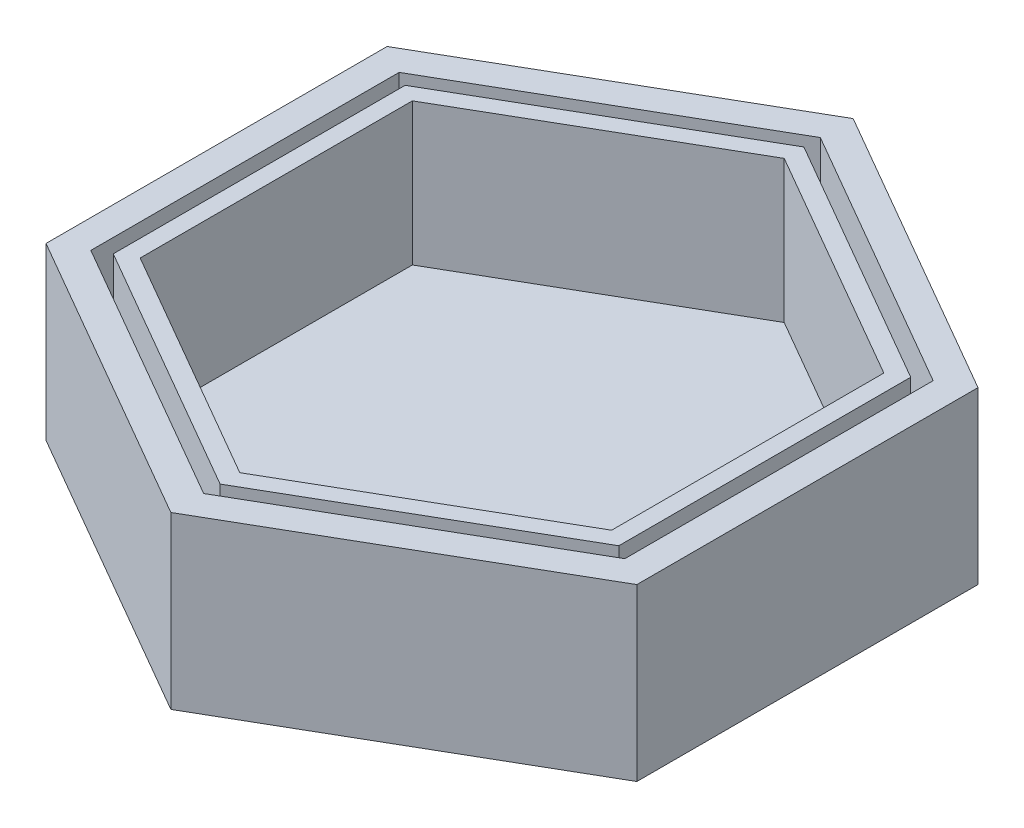
ISO-10303-21;
HEADER;
FILE_DESCRIPTION(('STEP AP214'),'2;1');
FILE_NAME('part.step','',(''),(''),'','','');
FILE_SCHEMA(('AUTOMOTIVE_DESIGN { 1 0 10303 214 1 1 1 1 }'));
ENDSEC;
DATA;
#1=APPLICATION_CONTEXT('core data for automotive mechanical design processes');
#2=APPLICATION_PROTOCOL_DEFINITION('international standard','automotive_design',2000,#1);
#3=PRODUCT_CONTEXT('',#1,'mechanical');
#4=PRODUCT('Part','Part','',(#3));
#5=PRODUCT_RELATED_PRODUCT_CATEGORY('part','',(#4));
#6=PRODUCT_DEFINITION_FORMATION('','',#4);
#7=PRODUCT_DEFINITION_CONTEXT('part definition',#1,'design');
#8=PRODUCT_DEFINITION('design','',#6,#7);
#9=PRODUCT_DEFINITION_SHAPE('','',#8);
#10=(LENGTH_UNIT() NAMED_UNIT(*) SI_UNIT(.MILLI.,.METRE.));
#11=(NAMED_UNIT(*) PLANE_ANGLE_UNIT() SI_UNIT($,.RADIAN.));
#12=(NAMED_UNIT(*) SI_UNIT($,.STERADIAN.) SOLID_ANGLE_UNIT());
#13=UNCERTAINTY_MEASURE_WITH_UNIT(LENGTH_MEASURE(1.E-05),#10,'distance_accuracy_value','');
#14=(GEOMETRIC_REPRESENTATION_CONTEXT(3) GLOBAL_UNCERTAINTY_ASSIGNED_CONTEXT((#13)) GLOBAL_UNIT_ASSIGNED_CONTEXT((#10,
#11,#12)) REPRESENTATION_CONTEXT('',''));
#15=CARTESIAN_POINT('',(0.,0.,0.));
#16=DIRECTION('',(0.,0.,1.));
#17=DIRECTION('',(1.,0.,0.));
#18=AXIS2_PLACEMENT_3D('',#15,#16,#17);
#19=CARTESIAN_POINT('',(-51.9615242270663,5.,30.));
#20=DIRECTION('',(0.5,0.,-0.866025403784439));
#21=DIRECTION('',(-0.866025403784439,0.,-0.5));
#22=AXIS2_PLACEMENT_3D('',#19,#20,#21);
#23=PLANE('',#22);
#24=DIRECTION('',(0.866025403784439,0.,0.5));
#25=VECTOR('',#24,1.);
#26=CARTESIAN_POINT('',(-51.9615242270663,0.,30.));
#27=LINE('',#26,#25);
#28=CARTESIAN_POINT('',(-51.9615242270663,0.,30.));
#29=VERTEX_POINT('',#28);
#30=CARTESIAN_POINT('',(0.,0.,60.));
#31=VERTEX_POINT('',#30);
#32=EDGE_CURVE('E392',#29,#31,#27,.T.);
#33=ORIENTED_EDGE('',*,*,#32,.T.);
#34=DIRECTION('',(0.,-1.,0.));
#35=VECTOR('',#34,1.);
#36=CARTESIAN_POINT('',(0.,5.,60.));
#37=LINE('',#36,#35);
#38=CARTESIAN_POINT('',(0.,30.,60.));
#39=VERTEX_POINT('',#38);
#40=EDGE_CURVE('E11',#39,#31,#37,.T.);
#41=ORIENTED_EDGE('',*,*,#40,.F.);
#42=DIRECTION('',(0.866025403784439,0.,0.5));
#43=VECTOR('',#42,1.);
#44=CARTESIAN_POINT('',(-51.9615242270663,30.,30.));
#45=LINE('',#44,#43);
#46=CARTESIAN_POINT('',(-51.9615242270663,30.,30.));
#47=VERTEX_POINT('',#46);
#48=EDGE_CURVE('E377',#47,#39,#45,.T.);
#49=ORIENTED_EDGE('',*,*,#48,.F.);
#50=DIRECTION('',(0.,-1.,0.));
#51=VECTOR('',#50,1.);
#52=CARTESIAN_POINT('',(-51.9615242270663,5.,30.));
#53=LINE('',#52,#51);
#54=EDGE_CURVE('E405',#47,#29,#53,.T.);
#55=ORIENTED_EDGE('',*,*,#54,.T.);
#56=EDGE_LOOP('',(#33,#41,#49,#55));
#57=FACE_BOUND('',#56,.T.);
#58=ADVANCED_FACE('F43',(#57),#23,.F.);
#59=CARTESIAN_POINT('',(0.,5.,60.));
#60=DIRECTION('',(-0.5,0.,-0.866025403784439));
#61=DIRECTION('',(-0.866025403784439,0.,0.5));
#62=AXIS2_PLACEMENT_3D('',#59,#60,#61);
#63=PLANE('',#62);
#64=DIRECTION('',(0.866025403784439,0.,-0.5));
#65=VECTOR('',#64,1.);
#66=CARTESIAN_POINT('',(0.,0.,60.));
#67=LINE('',#66,#65);
#68=CARTESIAN_POINT('',(51.9615242270663,0.,30.));
#69=VERTEX_POINT('',#68);
#70=EDGE_CURVE('E395',#31,#69,#67,.T.);
#71=ORIENTED_EDGE('',*,*,#70,.T.);
#72=DIRECTION('',(0.,-1.,0.));
#73=VECTOR('',#72,1.);
#74=CARTESIAN_POINT('',(51.9615242270663,5.,30.));
#75=LINE('',#74,#73);
#76=CARTESIAN_POINT('',(51.9615242270663,30.,30.));
#77=VERTEX_POINT('',#76);
#78=EDGE_CURVE('E50',#77,#69,#75,.T.);
#79=ORIENTED_EDGE('',*,*,#78,.F.);
#80=DIRECTION('',(0.866025403784439,0.,-0.5));
#81=VECTOR('',#80,1.);
#82=CARTESIAN_POINT('',(0.,30.,60.));
#83=LINE('',#82,#81);
#84=EDGE_CURVE('E380',#39,#77,#83,.T.);
#85=ORIENTED_EDGE('',*,*,#84,.F.);
#86=ORIENTED_EDGE('',*,*,#40,.T.);
#87=EDGE_LOOP('',(#71,#79,#85,#86));
#88=FACE_BOUND('',#87,.T.);
#89=ADVANCED_FACE('F443',(#88),#63,.F.);
#90=CARTESIAN_POINT('',(51.9615242270663,5.,30.));
#91=DIRECTION('',(-1.,0.,0.));
#92=DIRECTION('',(0.,0.,1.));
#93=AXIS2_PLACEMENT_3D('',#90,#91,#92);
#94=PLANE('',#93);
#95=DIRECTION('',(0.,0.,-1.));
#96=VECTOR('',#95,1.);
#97=CARTESIAN_POINT('',(51.9615242270663,0.,30.));
#98=LINE('',#97,#96);
#99=CARTESIAN_POINT('',(51.9615242270663,0.,-30.));
#100=VERTEX_POINT('',#99);
#101=EDGE_CURVE('E397',#69,#100,#98,.T.);
#102=ORIENTED_EDGE('',*,*,#101,.T.);
#103=DIRECTION('',(0.,-1.,0.));
#104=VECTOR('',#103,1.);
#105=CARTESIAN_POINT('',(51.9615242270663,5.,-30.));
#106=LINE('',#105,#104);
#107=CARTESIAN_POINT('',(51.9615242270663,30.,-30.));
#108=VERTEX_POINT('',#107);
#109=EDGE_CURVE('E414',#108,#100,#106,.T.);
#110=ORIENTED_EDGE('',*,*,#109,.F.);
#111=DIRECTION('',(0.,0.,-1.));
#112=VECTOR('',#111,1.);
#113=CARTESIAN_POINT('',(51.9615242270663,30.,30.));
#114=LINE('',#113,#112);
#115=EDGE_CURVE('E383',#77,#108,#114,.T.);
#116=ORIENTED_EDGE('',*,*,#115,.F.);
#117=ORIENTED_EDGE('',*,*,#78,.T.);
#118=EDGE_LOOP('',(#102,#110,#116,#117));
#119=FACE_BOUND('',#118,.T.);
#120=ADVANCED_FACE('F420',(#119),#94,.F.);
#121=CARTESIAN_POINT('',(51.9615242270663,5.,-30.));
#122=DIRECTION('',(-0.5,0.,0.866025403784439));
#123=DIRECTION('',(0.866025403784439,0.,0.5));
#124=AXIS2_PLACEMENT_3D('',#121,#122,#123);
#125=PLANE('',#124);
#126=DIRECTION('',(-0.866025403784439,0.,-0.5));
#127=VECTOR('',#126,1.);
#128=CARTESIAN_POINT('',(51.9615242270663,0.,-30.));
#129=LINE('',#128,#127);
#130=CARTESIAN_POINT('',(0.,0.,-60.));
#131=VERTEX_POINT('',#130);
#132=EDGE_CURVE('E399',#100,#131,#129,.T.);
#133=ORIENTED_EDGE('',*,*,#132,.T.);
#134=DIRECTION('',(0.,-1.,0.));
#135=VECTOR('',#134,1.);
#136=CARTESIAN_POINT('',(0.,5.,-60.));
#137=LINE('',#136,#135);
#138=CARTESIAN_POINT('',(0.,30.,-60.));
#139=VERTEX_POINT('',#138);
#140=EDGE_CURVE('E411',#139,#131,#137,.T.);
#141=ORIENTED_EDGE('',*,*,#140,.F.);
#142=DIRECTION('',(-0.866025403784439,0.,-0.5));
#143=VECTOR('',#142,1.);
#144=CARTESIAN_POINT('',(51.9615242270663,30.,-30.));
#145=LINE('',#144,#143);
#146=EDGE_CURVE('E386',#108,#139,#145,.T.);
#147=ORIENTED_EDGE('',*,*,#146,.F.);
#148=ORIENTED_EDGE('',*,*,#109,.T.);
#149=EDGE_LOOP('',(#133,#141,#147,#148));
#150=FACE_BOUND('',#149,.T.);
#151=ADVANCED_FACE('F430',(#150),#125,.F.);
#152=CARTESIAN_POINT('',(0.,5.,-60.));
#153=DIRECTION('',(0.5,0.,0.866025403784439));
#154=DIRECTION('',(0.866025403784439,0.,-0.5));
#155=AXIS2_PLACEMENT_3D('',#152,#153,#154);
#156=PLANE('',#155);
#157=DIRECTION('',(-0.866025403784439,0.,0.5));
#158=VECTOR('',#157,1.);
#159=CARTESIAN_POINT('',(0.,0.,-60.));
#160=LINE('',#159,#158);
#161=CARTESIAN_POINT('',(-51.9615242270663,0.,-30.));
#162=VERTEX_POINT('',#161);
#163=EDGE_CURVE('E401',#131,#162,#160,.T.);
#164=ORIENTED_EDGE('',*,*,#163,.T.);
#165=DIRECTION('',(0.,-1.,0.));
#166=VECTOR('',#165,1.);
#167=CARTESIAN_POINT('',(-51.9615242270663,5.,-30.));
#168=LINE('',#167,#166);
#169=CARTESIAN_POINT('',(-51.9615242270663,30.,-30.));
#170=VERTEX_POINT('',#169);
#171=EDGE_CURVE('E408',#170,#162,#168,.T.);
#172=ORIENTED_EDGE('',*,*,#171,.F.);
#173=DIRECTION('',(-0.866025403784439,0.,0.5));
#174=VECTOR('',#173,1.);
#175=CARTESIAN_POINT('',(0.,30.,-60.));
#176=LINE('',#175,#174);
#177=EDGE_CURVE('E389',#139,#170,#176,.T.);
#178=ORIENTED_EDGE('',*,*,#177,.F.);
#179=ORIENTED_EDGE('',*,*,#140,.T.);
#180=EDGE_LOOP('',(#164,#172,#178,#179));
#181=FACE_BOUND('',#180,.T.);
#182=ADVANCED_FACE('F434',(#181),#156,.F.);
#183=CARTESIAN_POINT('',(-51.9615242270663,5.,-30.));
#184=DIRECTION('',(1.,0.,0.));
#185=DIRECTION('',(0.,0.,-1.));
#186=AXIS2_PLACEMENT_3D('',#183,#184,#185);
#187=PLANE('',#186);
#188=DIRECTION('',(0.,0.,1.));
#189=VECTOR('',#188,1.);
#190=CARTESIAN_POINT('',(-51.9615242270663,0.,-30.));
#191=LINE('',#190,#189);
#192=EDGE_CURVE('E403',#162,#29,#191,.T.);
#193=ORIENTED_EDGE('',*,*,#192,.T.);
#194=ORIENTED_EDGE('',*,*,#54,.F.);
#195=DIRECTION('',(0.,0.,1.));
#196=VECTOR('',#195,1.);
#197=CARTESIAN_POINT('',(-51.9615242270663,30.,-30.));
#198=LINE('',#197,#196);
#199=EDGE_CURVE('E374',#170,#47,#198,.T.);
#200=ORIENTED_EDGE('',*,*,#199,.F.);
#201=ORIENTED_EDGE('',*,*,#171,.T.);
#202=EDGE_LOOP('',(#193,#194,#200,#201));
#203=FACE_BOUND('',#202,.T.);
#204=ADVANCED_FACE('F440',(#203),#187,.F.);
#205=CARTESIAN_POINT('',(0.,0.,0.));
#206=DIRECTION('',(0.,1.,0.));
#207=DIRECTION('',(0.,0.,1.));
#208=AXIS2_PLACEMENT_3D('',#205,#206,#207);
#209=PLANE('',#208);
#210=ORIENTED_EDGE('',*,*,#32,.F.);
#211=ORIENTED_EDGE('',*,*,#192,.F.);
#212=ORIENTED_EDGE('',*,*,#163,.F.);
#213=ORIENTED_EDGE('',*,*,#132,.F.);
#214=ORIENTED_EDGE('',*,*,#101,.F.);
#215=ORIENTED_EDGE('',*,*,#70,.F.);
#216=EDGE_LOOP('',(#210,#211,#212,#213,#214,#215));
#217=FACE_BOUND('',#216,.T.);
#218=ADVANCED_FACE('F426',(#217),#209,.F.);
#219=CARTESIAN_POINT('',(0.,30.,0.));
#220=DIRECTION('',(0.,1.,0.));
#221=DIRECTION('',(0.,0.,1.));
#222=AXIS2_PLACEMENT_3D('',#219,#220,#221);
#223=PLANE('',#222);
#224=ORIENTED_EDGE('',*,*,#199,.T.);
#225=ORIENTED_EDGE('',*,*,#48,.T.);
#226=ORIENTED_EDGE('',*,*,#84,.T.);
#227=ORIENTED_EDGE('',*,*,#115,.T.);
#228=ORIENTED_EDGE('',*,*,#146,.T.);
#229=ORIENTED_EDGE('',*,*,#177,.T.);
#230=EDGE_LOOP('',(#224,#225,#226,#227,#228,#229));
#231=FACE_BOUND('',#230,.T.);
#232=DIRECTION('',(0.866025403784439,0.,0.5));
#233=VECTOR('',#232,1.);
#234=CARTESIAN_POINT('',(-46.9615242270663,30.,27.1132486540519));
#235=LINE('',#234,#233);
#236=CARTESIAN_POINT('',(-46.9615242270663,30.,27.1132486540519));
#237=VERTEX_POINT('',#236);
#238=CARTESIAN_POINT('',(0.,30.,54.2264973081037));
#239=VERTEX_POINT('',#238);
#240=EDGE_CURVE('E334',#237,#239,#235,.T.);
#241=ORIENTED_EDGE('',*,*,#240,.F.);
#242=DIRECTION('',(0.,0.,1.));
#243=VECTOR('',#242,1.);
#244=CARTESIAN_POINT('',(-46.9615242270663,30.,-27.1132486540519));
#245=LINE('',#244,#243);
#246=CARTESIAN_POINT('',(-46.9615242270663,30.,-27.1132486540519));
#247=VERTEX_POINT('',#246);
#248=EDGE_CURVE('E332',#247,#237,#245,.T.);
#249=ORIENTED_EDGE('',*,*,#248,.F.);
#250=DIRECTION('',(-0.866025403784439,0.,0.5));
#251=VECTOR('',#250,1.);
#252=CARTESIAN_POINT('',(0.,30.,-54.2264973081037));
#253=LINE('',#252,#251);
#254=CARTESIAN_POINT('',(0.,30.,-54.2264973081037));
#255=VERTEX_POINT('',#254);
#256=EDGE_CURVE('E344',#255,#247,#253,.T.);
#257=ORIENTED_EDGE('',*,*,#256,.F.);
#258=DIRECTION('',(-0.866025403784439,0.,-0.5));
#259=VECTOR('',#258,1.);
#260=CARTESIAN_POINT('',(46.9615242270663,30.,-27.1132486540519));
#261=LINE('',#260,#259);
#262=CARTESIAN_POINT('',(46.9615242270663,30.,-27.1132486540519));
#263=VERTEX_POINT('',#262);
#264=EDGE_CURVE('E341',#263,#255,#261,.T.);
#265=ORIENTED_EDGE('',*,*,#264,.F.);
#266=DIRECTION('',(0.,0.,-1.));
#267=VECTOR('',#266,1.);
#268=CARTESIAN_POINT('',(46.9615242270663,30.,27.1132486540519));
#269=LINE('',#268,#267);
#270=CARTESIAN_POINT('',(46.9615242270663,30.,27.1132486540519));
#271=VERTEX_POINT('',#270);
#272=EDGE_CURVE('E339',#271,#263,#269,.T.);
#273=ORIENTED_EDGE('',*,*,#272,.F.);
#274=DIRECTION('',(0.866025403784439,0.,-0.5));
#275=VECTOR('',#274,1.);
#276=CARTESIAN_POINT('',(0.,30.,54.2264973081037));
#277=LINE('',#276,#275);
#278=EDGE_CURVE('E337',#239,#271,#277,.T.);
#279=ORIENTED_EDGE('',*,*,#278,.F.);
#280=EDGE_LOOP('',(#241,#249,#257,#265,#273,#279));
#281=FACE_BOUND('',#280,.T.);
#282=ADVANCED_FACE('F437',(#231,#281),#223,.T.);
#283=CARTESIAN_POINT('',(-46.9615242270663,30.,-27.1132486540519));
#284=DIRECTION('',(1.,0.,0.));
#285=DIRECTION('',(0.,0.,-1.));
#286=AXIS2_PLACEMENT_3D('',#283,#284,#285);
#287=PLANE('',#286);
#288=DIRECTION('',(0.,0.,1.));
#289=VECTOR('',#288,1.);
#290=CARTESIAN_POINT('',(-46.9615242270663,5.,-27.1132486540519));
#291=LINE('',#290,#289);
#292=CARTESIAN_POINT('',(-46.9615242270663,5.,-27.1132486540519));
#293=VERTEX_POINT('',#292);
#294=CARTESIAN_POINT('',(-46.9615242270663,5.,27.1132486540519));
#295=VERTEX_POINT('',#294);
#296=EDGE_CURVE('E331',#293,#295,#291,.T.);
#297=ORIENTED_EDGE('',*,*,#296,.F.);
#298=DIRECTION('',(0.,-1.,0.));
#299=VECTOR('',#298,1.);
#300=CARTESIAN_POINT('',(-46.9615242270663,30.,-27.1132486540519));
#301=LINE('',#300,#299);
#302=EDGE_CURVE('E346',#247,#293,#301,.T.);
#303=ORIENTED_EDGE('',*,*,#302,.F.);
#304=ORIENTED_EDGE('',*,*,#248,.T.);
#305=DIRECTION('',(0.,-1.,0.));
#306=VECTOR('',#305,1.);
#307=CARTESIAN_POINT('',(-46.9615242270663,30.,27.1132486540519));
#308=LINE('',#307,#306);
#309=EDGE_CURVE('E371',#237,#295,#308,.T.);
#310=ORIENTED_EDGE('',*,*,#309,.T.);
#311=EDGE_LOOP('',(#297,#303,#304,#310));
#312=FACE_BOUND('',#311,.T.);
#313=ADVANCED_FACE('F465',(#312),#287,.T.);
#314=CARTESIAN_POINT('',(-46.9615242270663,30.,27.1132486540519));
#315=DIRECTION('',(0.5,0.,-0.866025403784439));
#316=DIRECTION('',(-0.866025403784439,0.,-0.5));
#317=AXIS2_PLACEMENT_3D('',#314,#315,#316);
#318=PLANE('',#317);
#319=DIRECTION('',(0.866025403784439,0.,0.5));
#320=VECTOR('',#319,1.);
#321=CARTESIAN_POINT('',(-46.9615242270663,5.,27.1132486540519));
#322=LINE('',#321,#320);
#323=CARTESIAN_POINT('',(0.,5.,54.2264973081037));
#324=VERTEX_POINT('',#323);
#325=EDGE_CURVE('E348',#295,#324,#322,.T.);
#326=ORIENTED_EDGE('',*,*,#325,.F.);
#327=ORIENTED_EDGE('',*,*,#309,.F.);
#328=ORIENTED_EDGE('',*,*,#240,.T.);
#329=DIRECTION('',(0.,-1.,0.));
#330=VECTOR('',#329,1.);
#331=CARTESIAN_POINT('',(0.,30.,54.2264973081037));
#332=LINE('',#331,#330);
#333=EDGE_CURVE('E368',#239,#324,#332,.T.);
#334=ORIENTED_EDGE('',*,*,#333,.T.);
#335=EDGE_LOOP('',(#326,#327,#328,#334));
#336=FACE_BOUND('',#335,.T.);
#337=ADVANCED_FACE('F468',(#336),#318,.T.);
#338=CARTESIAN_POINT('',(0.,30.,54.2264973081037));
#339=DIRECTION('',(-0.5,0.,-0.866025403784439));
#340=DIRECTION('',(-0.866025403784439,0.,0.5));
#341=AXIS2_PLACEMENT_3D('',#338,#339,#340);
#342=PLANE('',#341);
#343=DIRECTION('',(0.866025403784439,0.,-0.5));
#344=VECTOR('',#343,1.);
#345=CARTESIAN_POINT('',(0.,5.,54.2264973081037));
#346=LINE('',#345,#344);
#347=CARTESIAN_POINT('',(46.9615242270663,5.,27.1132486540519));
#348=VERTEX_POINT('',#347);
#349=EDGE_CURVE('E350',#324,#348,#346,.T.);
#350=ORIENTED_EDGE('',*,*,#349,.F.);
#351=ORIENTED_EDGE('',*,*,#333,.F.);
#352=ORIENTED_EDGE('',*,*,#278,.T.);
#353=DIRECTION('',(0.,-1.,0.));
#354=VECTOR('',#353,1.);
#355=CARTESIAN_POINT('',(46.9615242270663,30.,27.1132486540519));
#356=LINE('',#355,#354);
#357=EDGE_CURVE('E365',#271,#348,#356,.T.);
#358=ORIENTED_EDGE('',*,*,#357,.T.);
#359=EDGE_LOOP('',(#350,#351,#352,#358));
#360=FACE_BOUND('',#359,.T.);
#361=ADVANCED_FACE('F472',(#360),#342,.T.);
#362=CARTESIAN_POINT('',(46.9615242270663,30.,27.1132486540519));
#363=DIRECTION('',(-1.,0.,0.));
#364=DIRECTION('',(0.,0.,1.));
#365=AXIS2_PLACEMENT_3D('',#362,#363,#364);
#366=PLANE('',#365);
#367=DIRECTION('',(0.,0.,-1.));
#368=VECTOR('',#367,1.);
#369=CARTESIAN_POINT('',(46.9615242270663,5.,27.1132486540519));
#370=LINE('',#369,#368);
#371=CARTESIAN_POINT('',(46.9615242270663,5.,-27.1132486540519));
#372=VERTEX_POINT('',#371);
#373=EDGE_CURVE('E352',#348,#372,#370,.T.);
#374=ORIENTED_EDGE('',*,*,#373,.F.);
#375=ORIENTED_EDGE('',*,*,#357,.F.);
#376=ORIENTED_EDGE('',*,*,#272,.T.);
#377=DIRECTION('',(0.,-1.,0.));
#378=VECTOR('',#377,1.);
#379=CARTESIAN_POINT('',(46.9615242270663,30.,-27.1132486540519));
#380=LINE('',#379,#378);
#381=EDGE_CURVE('E362',#263,#372,#380,.T.);
#382=ORIENTED_EDGE('',*,*,#381,.T.);
#383=EDGE_LOOP('',(#374,#375,#376,#382));
#384=FACE_BOUND('',#383,.T.);
#385=ADVANCED_FACE('F476',(#384),#366,.T.);
#386=CARTESIAN_POINT('',(46.9615242270663,30.,-27.1132486540519));
#387=DIRECTION('',(-0.5,0.,0.866025403784439));
#388=DIRECTION('',(0.866025403784439,0.,0.5));
#389=AXIS2_PLACEMENT_3D('',#386,#387,#388);
#390=PLANE('',#389);
#391=DIRECTION('',(-0.866025403784439,0.,-0.5));
#392=VECTOR('',#391,1.);
#393=CARTESIAN_POINT('',(46.9615242270663,5.,-27.1132486540519));
#394=LINE('',#393,#392);
#395=CARTESIAN_POINT('',(0.,5.,-54.2264973081037));
#396=VERTEX_POINT('',#395);
#397=EDGE_CURVE('E354',#372,#396,#394,.T.);
#398=ORIENTED_EDGE('',*,*,#397,.F.);
#399=ORIENTED_EDGE('',*,*,#381,.F.);
#400=ORIENTED_EDGE('',*,*,#264,.T.);
#401=DIRECTION('',(0.,-1.,0.));
#402=VECTOR('',#401,1.);
#403=CARTESIAN_POINT('',(0.,30.,-54.2264973081037));
#404=LINE('',#403,#402);
#405=EDGE_CURVE('E359',#255,#396,#404,.T.);
#406=ORIENTED_EDGE('',*,*,#405,.T.);
#407=EDGE_LOOP('',(#398,#399,#400,#406));
#408=FACE_BOUND('',#407,.T.);
#409=ADVANCED_FACE('F480',(#408),#390,.T.);
#410=CARTESIAN_POINT('',(0.,30.,-54.2264973081037));
#411=DIRECTION('',(0.5,0.,0.866025403784439));
#412=DIRECTION('',(0.866025403784439,0.,-0.5));
#413=AXIS2_PLACEMENT_3D('',#410,#411,#412);
#414=PLANE('',#413);
#415=DIRECTION('',(-0.866025403784439,0.,0.5));
#416=VECTOR('',#415,1.);
#417=CARTESIAN_POINT('',(0.,5.,-54.2264973081037));
#418=LINE('',#417,#416);
#419=EDGE_CURVE('E335',#396,#293,#418,.T.);
#420=ORIENTED_EDGE('',*,*,#419,.F.);
#421=ORIENTED_EDGE('',*,*,#405,.F.);
#422=ORIENTED_EDGE('',*,*,#256,.T.);
#423=ORIENTED_EDGE('',*,*,#302,.T.);
#424=EDGE_LOOP('',(#420,#421,#422,#423));
#425=FACE_BOUND('',#424,.T.);
#426=ADVANCED_FACE('F484',(#425),#414,.T.);
#427=CARTESIAN_POINT('',(0.,30.,0.));
#428=DIRECTION('',(0.,1.,0.));
#429=DIRECTION('',(0.,0.,1.));
#430=AXIS2_PLACEMENT_3D('',#427,#428,#429);
#431=PLANE('',#430);
#432=DIRECTION('',(-0.866025403784439,0.,0.5));
#433=VECTOR('',#432,1.);
#434=CARTESIAN_POINT('',(0.,30.,-51.3397459621556));
#435=LINE('',#434,#433);
#436=CARTESIAN_POINT('',(0.,30.,-51.3397459621556));
#437=VERTEX_POINT('',#436);
#438=CARTESIAN_POINT('',(-44.4615242270663,30.,-25.6698729810778));
#439=VERTEX_POINT('',#438);
#440=EDGE_CURVE('E287',#437,#439,#435,.T.);
#441=ORIENTED_EDGE('',*,*,#440,.T.);
#442=DIRECTION('',(0.,0.,1.));
#443=VECTOR('',#442,1.);
#444=CARTESIAN_POINT('',(-44.4615242270663,30.,-25.6698729810778));
#445=LINE('',#444,#443);
#446=CARTESIAN_POINT('',(-44.4615242270663,30.,25.6698729810778));
#447=VERTEX_POINT('',#446);
#448=EDGE_CURVE('E290',#439,#447,#445,.T.);
#449=ORIENTED_EDGE('',*,*,#448,.T.);
#450=DIRECTION('',(0.866025403784439,0.,0.5));
#451=VECTOR('',#450,1.);
#452=CARTESIAN_POINT('',(-44.4615242270663,30.,25.6698729810778));
#453=LINE('',#452,#451);
#454=CARTESIAN_POINT('',(0.,30.,51.3397459621556));
#455=VERTEX_POINT('',#454);
#456=EDGE_CURVE('E293',#447,#455,#453,.T.);
#457=ORIENTED_EDGE('',*,*,#456,.T.);
#458=DIRECTION('',(0.866025403784439,0.,-0.5));
#459=VECTOR('',#458,1.);
#460=CARTESIAN_POINT('',(0.,30.,51.3397459621556));
#461=LINE('',#460,#459);
#462=CARTESIAN_POINT('',(44.4615242270663,30.,25.6698729810778));
#463=VERTEX_POINT('',#462);
#464=EDGE_CURVE('E295',#455,#463,#461,.T.);
#465=ORIENTED_EDGE('',*,*,#464,.T.);
#466=DIRECTION('',(0.,0.,-1.));
#467=VECTOR('',#466,1.);
#468=CARTESIAN_POINT('',(44.4615242270663,30.,25.6698729810778));
#469=LINE('',#468,#467);
#470=CARTESIAN_POINT('',(44.4615242270663,30.,-25.6698729810778));
#471=VERTEX_POINT('',#470);
#472=EDGE_CURVE('E297',#463,#471,#469,.T.);
#473=ORIENTED_EDGE('',*,*,#472,.T.);
#474=DIRECTION('',(-0.866025403784439,0.,-0.5));
#475=VECTOR('',#474,1.);
#476=CARTESIAN_POINT('',(44.4615242270663,30.,-25.6698729810778));
#477=LINE('',#476,#475);
#478=EDGE_CURVE('E299',#471,#437,#477,.T.);
#479=ORIENTED_EDGE('',*,*,#478,.T.);
#480=EDGE_LOOP('',(#441,#449,#457,#465,#473,#479));
#481=FACE_BOUND('',#480,.T.);
#482=DIRECTION('',(-0.866025403784439,0.,0.5));
#483=VECTOR('',#482,1.);
#484=CARTESIAN_POINT('',(0.,30.,-47.8756443470179));
#485=LINE('',#484,#483);
#486=CARTESIAN_POINT('',(0.,30.,-47.8756443470179));
#487=VERTEX_POINT('',#486);
#488=CARTESIAN_POINT('',(-41.4615242270663,30.,-23.9378221735089));
#489=VERTEX_POINT('',#488);
#490=EDGE_CURVE('E247',#487,#489,#485,.T.);
#491=ORIENTED_EDGE('',*,*,#490,.F.);
#492=DIRECTION('',(-0.866025403784438,0.,-0.5));
#493=VECTOR('',#492,1.);
#494=CARTESIAN_POINT('',(41.4615242270663,30.,-23.9378221735089));
#495=LINE('',#494,#493);
#496=CARTESIAN_POINT('',(41.4615242270663,30.,-23.9378221735089));
#497=VERTEX_POINT('',#496);
#498=EDGE_CURVE('E245',#497,#487,#495,.T.);
#499=ORIENTED_EDGE('',*,*,#498,.F.);
#500=DIRECTION('',(0.,0.,-1.));
#501=VECTOR('',#500,1.);
#502=CARTESIAN_POINT('',(41.4615242270663,30.,23.9378221735089));
#503=LINE('',#502,#501);
#504=CARTESIAN_POINT('',(41.4615242270663,30.,23.9378221735089));
#505=VERTEX_POINT('',#504);
#506=EDGE_CURVE('E257',#505,#497,#503,.T.);
#507=ORIENTED_EDGE('',*,*,#506,.F.);
#508=DIRECTION('',(0.866025403784439,0.,-0.5));
#509=VECTOR('',#508,1.);
#510=CARTESIAN_POINT('',(0.,30.,47.8756443470178));
#511=LINE('',#510,#509);
#512=CARTESIAN_POINT('',(0.,30.,47.8756443470178));
#513=VERTEX_POINT('',#512);
#514=EDGE_CURVE('E254',#513,#505,#511,.T.);
#515=ORIENTED_EDGE('',*,*,#514,.F.);
#516=DIRECTION('',(0.866025403784439,0.,0.5));
#517=VECTOR('',#516,1.);
#518=CARTESIAN_POINT('',(-41.4615242270663,30.,23.9378221735089));
#519=LINE('',#518,#517);
#520=CARTESIAN_POINT('',(-41.4615242270663,30.,23.9378221735089));
#521=VERTEX_POINT('',#520);
#522=EDGE_CURVE('E252',#521,#513,#519,.T.);
#523=ORIENTED_EDGE('',*,*,#522,.F.);
#524=DIRECTION('',(0.,0.,1.));
#525=VECTOR('',#524,1.);
#526=CARTESIAN_POINT('',(-41.4615242270663,30.,-23.9378221735089));
#527=LINE('',#526,#525);
#528=EDGE_CURVE('E250',#489,#521,#527,.T.);
#529=ORIENTED_EDGE('',*,*,#528,.F.);
#530=EDGE_LOOP('',(#491,#499,#507,#515,#523,#529));
#531=FACE_BOUND('',#530,.T.);
#532=ADVANCED_FACE('F488',(#481,#531),#431,.T.);
#533=CARTESIAN_POINT('',(0.,30.,-51.3397459621556));
#534=DIRECTION('',(0.5,0.,0.866025403784439));
#535=DIRECTION('',(0.866025403784439,0.,-0.5));
#536=AXIS2_PLACEMENT_3D('',#533,#534,#535);
#537=PLANE('',#536);
#538=DIRECTION('',(-0.866025403784439,0.,0.5));
#539=VECTOR('',#538,1.);
#540=CARTESIAN_POINT('',(0.,5.,-51.3397459621556));
#541=LINE('',#540,#539);
#542=CARTESIAN_POINT('',(0.,5.,-51.3397459621556));
#543=VERTEX_POINT('',#542);
#544=CARTESIAN_POINT('',(-44.4615242270663,5.,-25.6698729810778));
#545=VERTEX_POINT('',#544);
#546=EDGE_CURVE('E286',#543,#545,#541,.T.);
#547=ORIENTED_EDGE('',*,*,#546,.T.);
#548=DIRECTION('',(0.,-1.,0.));
#549=VECTOR('',#548,1.);
#550=CARTESIAN_POINT('',(-44.4615242270663,30.,-25.6698729810778));
#551=LINE('',#550,#549);
#552=EDGE_CURVE('E329',#439,#545,#551,.T.);
#553=ORIENTED_EDGE('',*,*,#552,.F.);
#554=ORIENTED_EDGE('',*,*,#440,.F.);
#555=DIRECTION('',(0.,-1.,0.));
#556=VECTOR('',#555,1.);
#557=CARTESIAN_POINT('',(0.,30.,-51.3397459621556));
#558=LINE('',#557,#556);
#559=EDGE_CURVE('E301',#437,#543,#558,.T.);
#560=ORIENTED_EDGE('',*,*,#559,.T.);
#561=EDGE_LOOP('',(#547,#553,#554,#560));
#562=FACE_BOUND('',#561,.T.);
#563=ADVANCED_FACE('F490',(#562),#537,.F.);
#564=CARTESIAN_POINT('',(-44.4615242270663,30.,-25.6698729810778));
#565=DIRECTION('',(1.,0.,0.));
#566=DIRECTION('',(0.,0.,-1.));
#567=AXIS2_PLACEMENT_3D('',#564,#565,#566);
#568=PLANE('',#567);
#569=DIRECTION('',(0.,0.,1.));
#570=VECTOR('',#569,1.);
#571=CARTESIAN_POINT('',(-44.4615242270663,5.,-25.6698729810778));
#572=LINE('',#571,#570);
#573=CARTESIAN_POINT('',(-44.4615242270663,5.,25.6698729810778));
#574=VERTEX_POINT('',#573);
#575=EDGE_CURVE('E304',#545,#574,#572,.T.);
#576=ORIENTED_EDGE('',*,*,#575,.T.);
#577=DIRECTION('',(0.,-1.,0.));
#578=VECTOR('',#577,1.);
#579=CARTESIAN_POINT('',(-44.4615242270663,30.,25.6698729810778));
#580=LINE('',#579,#578);
#581=EDGE_CURVE('E326',#447,#574,#580,.T.);
#582=ORIENTED_EDGE('',*,*,#581,.F.);
#583=ORIENTED_EDGE('',*,*,#448,.F.);
#584=ORIENTED_EDGE('',*,*,#552,.T.);
#585=EDGE_LOOP('',(#576,#582,#583,#584));
#586=FACE_BOUND('',#585,.T.);
#587=ADVANCED_FACE('F493',(#586),#568,.F.);
#588=CARTESIAN_POINT('',(-44.4615242270663,30.,25.6698729810778));
#589=DIRECTION('',(0.5,0.,-0.866025403784439));
#590=DIRECTION('',(-0.866025403784439,0.,-0.5));
#591=AXIS2_PLACEMENT_3D('',#588,#589,#590);
#592=PLANE('',#591);
#593=DIRECTION('',(0.866025403784439,0.,0.5));
#594=VECTOR('',#593,1.);
#595=CARTESIAN_POINT('',(-44.4615242270663,5.,25.6698729810778));
#596=LINE('',#595,#594);
#597=CARTESIAN_POINT('',(0.,5.,51.3397459621556));
#598=VERTEX_POINT('',#597);
#599=EDGE_CURVE('E306',#574,#598,#596,.T.);
#600=ORIENTED_EDGE('',*,*,#599,.T.);
#601=DIRECTION('',(0.,-1.,0.));
#602=VECTOR('',#601,1.);
#603=CARTESIAN_POINT('',(0.,30.,51.3397459621556));
#604=LINE('',#603,#602);
#605=EDGE_CURVE('E323',#455,#598,#604,.T.);
#606=ORIENTED_EDGE('',*,*,#605,.F.);
#607=ORIENTED_EDGE('',*,*,#456,.F.);
#608=ORIENTED_EDGE('',*,*,#581,.T.);
#609=EDGE_LOOP('',(#600,#606,#607,#608));
#610=FACE_BOUND('',#609,.T.);
#611=ADVANCED_FACE('F497',(#610),#592,.F.);
#612=CARTESIAN_POINT('',(0.,30.,51.3397459621556));
#613=DIRECTION('',(-0.5,0.,-0.866025403784438));
#614=DIRECTION('',(-0.866025403784439,0.,0.5));
#615=AXIS2_PLACEMENT_3D('',#612,#613,#614);
#616=PLANE('',#615);
#617=DIRECTION('',(0.866025403784439,0.,-0.5));
#618=VECTOR('',#617,1.);
#619=CARTESIAN_POINT('',(0.,5.,51.3397459621556));
#620=LINE('',#619,#618);
#621=CARTESIAN_POINT('',(44.4615242270663,5.,25.6698729810778));
#622=VERTEX_POINT('',#621);
#623=EDGE_CURVE('E308',#598,#622,#620,.T.);
#624=ORIENTED_EDGE('',*,*,#623,.T.);
#625=DIRECTION('',(0.,-1.,0.));
#626=VECTOR('',#625,1.);
#627=CARTESIAN_POINT('',(44.4615242270663,30.,25.6698729810778));
#628=LINE('',#627,#626);
#629=EDGE_CURVE('E320',#463,#622,#628,.T.);
#630=ORIENTED_EDGE('',*,*,#629,.F.);
#631=ORIENTED_EDGE('',*,*,#464,.F.);
#632=ORIENTED_EDGE('',*,*,#605,.T.);
#633=EDGE_LOOP('',(#624,#630,#631,#632));
#634=FACE_BOUND('',#633,.T.);
#635=ADVANCED_FACE('F501',(#634),#616,.F.);
#636=CARTESIAN_POINT('',(44.4615242270663,30.,25.6698729810778));
#637=DIRECTION('',(-1.,0.,0.));
#638=DIRECTION('',(0.,0.,1.));
#639=AXIS2_PLACEMENT_3D('',#636,#637,#638);
#640=PLANE('',#639);
#641=DIRECTION('',(0.,0.,-1.));
#642=VECTOR('',#641,1.);
#643=CARTESIAN_POINT('',(44.4615242270663,5.,25.6698729810778));
#644=LINE('',#643,#642);
#645=CARTESIAN_POINT('',(44.4615242270663,5.,5.));
#646=VERTEX_POINT('',#645);
#647=EDGE_CURVE('E311',#622,#646,#644,.T.);
#648=ORIENTED_EDGE('',*,*,#647,.T.);
#649=DIRECTION('',(0.,-0.707106781186548,0.707106781186548));
#650=VECTOR('',#649,1.);
#651=CARTESIAN_POINT('',(44.4615242270663,10.,0.));
#652=LINE('',#651,#650);
#653=CARTESIAN_POINT('',(44.4615242270663,10.,0.));
#654=VERTEX_POINT('',#653);
#655=EDGE_CURVE('E241',#654,#646,#652,.T.);
#656=ORIENTED_EDGE('',*,*,#655,.F.);
#657=DIRECTION('',(0.,0.707106781186548,0.707106781186548));
#658=VECTOR('',#657,1.);
#659=CARTESIAN_POINT('',(44.4615242270663,5.,-5.));
#660=LINE('',#659,#658);
#661=CARTESIAN_POINT('',(44.4615242270663,5.,-5.));
#662=VERTEX_POINT('',#661);
#663=EDGE_CURVE('E220',#662,#654,#660,.T.);
#664=ORIENTED_EDGE('',*,*,#663,.F.);
#665=CARTESIAN_POINT('',(44.4615242270663,5.,-25.6698729810778));
#666=VERTEX_POINT('',#665);
#667=EDGE_CURVE('E310',#662,#666,#644,.T.);
#668=ORIENTED_EDGE('',*,*,#667,.T.);
#669=DIRECTION('',(0.,-1.,0.));
#670=VECTOR('',#669,1.);
#671=CARTESIAN_POINT('',(44.4615242270663,30.,-25.6698729810778));
#672=LINE('',#671,#670);
#673=EDGE_CURVE('E317',#471,#666,#672,.T.);
#674=ORIENTED_EDGE('',*,*,#673,.F.);
#675=ORIENTED_EDGE('',*,*,#472,.F.);
#676=ORIENTED_EDGE('',*,*,#629,.T.);
#677=EDGE_LOOP('',(#648,#656,#664,#668,#674,#675,#676));
#678=FACE_BOUND('',#677,.T.);
#679=ADVANCED_FACE('F505',(#678),#640,.F.);
#680=CARTESIAN_POINT('',(44.4615242270663,30.,-25.6698729810778));
#681=DIRECTION('',(-0.5,0.,0.866025403784439));
#682=DIRECTION('',(0.866025403784439,0.,0.5));
#683=AXIS2_PLACEMENT_3D('',#680,#681,#682);
#684=PLANE('',#683);
#685=DIRECTION('',(-0.866025403784439,0.,-0.5));
#686=VECTOR('',#685,1.);
#687=CARTESIAN_POINT('',(44.4615242270663,5.,-25.6698729810778));
#688=LINE('',#687,#686);
#689=EDGE_CURVE('E291',#666,#543,#688,.T.);
#690=ORIENTED_EDGE('',*,*,#689,.T.);
#691=ORIENTED_EDGE('',*,*,#559,.F.);
#692=ORIENTED_EDGE('',*,*,#478,.F.);
#693=ORIENTED_EDGE('',*,*,#673,.T.);
#694=EDGE_LOOP('',(#690,#691,#692,#693));
#695=FACE_BOUND('',#694,.T.);
#696=ADVANCED_FACE('F509',(#695),#684,.F.);
#697=CARTESIAN_POINT('',(41.4615242270663,30.,-23.9378221735089));
#698=DIRECTION('',(-0.5,0.,0.866025403784438));
#699=DIRECTION('',(0.866025403784439,0.,0.5));
#700=AXIS2_PLACEMENT_3D('',#697,#698,#699);
#701=PLANE('',#700);
#702=DIRECTION('',(-0.866025403784438,0.,-0.5));
#703=VECTOR('',#702,1.);
#704=CARTESIAN_POINT('',(41.4615242270663,5.,-23.9378221735089));
#705=LINE('',#704,#703);
#706=CARTESIAN_POINT('',(41.4615242270663,5.,-23.9378221735089));
#707=VERTEX_POINT('',#706);
#708=CARTESIAN_POINT('',(0.,5.,-47.8756443470179));
#709=VERTEX_POINT('',#708);
#710=EDGE_CURVE('E244',#707,#709,#705,.T.);
#711=ORIENTED_EDGE('',*,*,#710,.F.);
#712=DIRECTION('',(0.,-1.,0.));
#713=VECTOR('',#712,1.);
#714=CARTESIAN_POINT('',(41.4615242270663,30.,-23.9378221735089));
#715=LINE('',#714,#713);
#716=EDGE_CURVE('E259',#497,#707,#715,.T.);
#717=ORIENTED_EDGE('',*,*,#716,.F.);
#718=ORIENTED_EDGE('',*,*,#498,.T.);
#719=DIRECTION('',(0.,-1.,0.));
#720=VECTOR('',#719,1.);
#721=CARTESIAN_POINT('',(0.,30.,-47.8756443470179));
#722=LINE('',#721,#720);
#723=EDGE_CURVE('E283',#487,#709,#722,.T.);
#724=ORIENTED_EDGE('',*,*,#723,.T.);
#725=EDGE_LOOP('',(#711,#717,#718,#724));
#726=FACE_BOUND('',#725,.T.);
#727=ADVANCED_FACE('F513',(#726),#701,.T.);
#728=CARTESIAN_POINT('',(0.,30.,-47.8756443470179));
#729=DIRECTION('',(0.5,0.,0.866025403784439));
#730=DIRECTION('',(0.866025403784439,0.,-0.5));
#731=AXIS2_PLACEMENT_3D('',#728,#729,#730);
#732=PLANE('',#731);
#733=DIRECTION('',(-0.866025403784439,0.,0.5));
#734=VECTOR('',#733,1.);
#735=CARTESIAN_POINT('',(0.,5.,-47.8756443470179));
#736=LINE('',#735,#734);
#737=CARTESIAN_POINT('',(-41.4615242270663,5.,-23.9378221735089));
#738=VERTEX_POINT('',#737);
#739=EDGE_CURVE('E261',#709,#738,#736,.T.);
#740=ORIENTED_EDGE('',*,*,#739,.F.);
#741=ORIENTED_EDGE('',*,*,#723,.F.);
#742=ORIENTED_EDGE('',*,*,#490,.T.);
#743=DIRECTION('',(0.,-1.,0.));
#744=VECTOR('',#743,1.);
#745=CARTESIAN_POINT('',(-41.4615242270663,30.,-23.9378221735089));
#746=LINE('',#745,#744);
#747=EDGE_CURVE('E280',#489,#738,#746,.T.);
#748=ORIENTED_EDGE('',*,*,#747,.T.);
#749=EDGE_LOOP('',(#740,#741,#742,#748));
#750=FACE_BOUND('',#749,.T.);
#751=ADVANCED_FACE('F520',(#750),#732,.T.);
#752=CARTESIAN_POINT('',(-41.4615242270663,30.,-23.9378221735089));
#753=DIRECTION('',(1.,0.,0.));
#754=DIRECTION('',(0.,0.,-1.));
#755=AXIS2_PLACEMENT_3D('',#752,#753,#754);
#756=PLANE('',#755);
#757=DIRECTION('',(0.,0.,1.));
#758=VECTOR('',#757,1.);
#759=CARTESIAN_POINT('',(-41.4615242270663,5.,-23.9378221735089));
#760=LINE('',#759,#758);
#761=CARTESIAN_POINT('',(-41.4615242270663,5.,23.9378221735089));
#762=VERTEX_POINT('',#761);
#763=EDGE_CURVE('E263',#738,#762,#760,.T.);
#764=ORIENTED_EDGE('',*,*,#763,.F.);
#765=ORIENTED_EDGE('',*,*,#747,.F.);
#766=ORIENTED_EDGE('',*,*,#528,.T.);
#767=DIRECTION('',(0.,-1.,0.));
#768=VECTOR('',#767,1.);
#769=CARTESIAN_POINT('',(-41.4615242270663,30.,23.9378221735089));
#770=LINE('',#769,#768);
#771=EDGE_CURVE('E277',#521,#762,#770,.T.);
#772=ORIENTED_EDGE('',*,*,#771,.T.);
#773=EDGE_LOOP('',(#764,#765,#766,#772));
#774=FACE_BOUND('',#773,.T.);
#775=ADVANCED_FACE('F524',(#774),#756,.T.);
#776=CARTESIAN_POINT('',(-41.4615242270663,30.,23.9378221735089));
#777=DIRECTION('',(0.5,0.,-0.866025403784439));
#778=DIRECTION('',(-0.866025403784439,0.,-0.5));
#779=AXIS2_PLACEMENT_3D('',#776,#777,#778);
#780=PLANE('',#779);
#781=DIRECTION('',(0.866025403784439,0.,0.5));
#782=VECTOR('',#781,1.);
#783=CARTESIAN_POINT('',(-41.4615242270663,5.,23.9378221735089));
#784=LINE('',#783,#782);
#785=CARTESIAN_POINT('',(0.,5.,47.8756443470178));
#786=VERTEX_POINT('',#785);
#787=EDGE_CURVE('E265',#762,#786,#784,.T.);
#788=ORIENTED_EDGE('',*,*,#787,.F.);
#789=ORIENTED_EDGE('',*,*,#771,.F.);
#790=ORIENTED_EDGE('',*,*,#522,.T.);
#791=DIRECTION('',(0.,-1.,0.));
#792=VECTOR('',#791,1.);
#793=CARTESIAN_POINT('',(0.,30.,47.8756443470178));
#794=LINE('',#793,#792);
#795=EDGE_CURVE('E274',#513,#786,#794,.T.);
#796=ORIENTED_EDGE('',*,*,#795,.T.);
#797=EDGE_LOOP('',(#788,#789,#790,#796));
#798=FACE_BOUND('',#797,.T.);
#799=ADVANCED_FACE('F528',(#798),#780,.T.);
#800=CARTESIAN_POINT('',(0.,30.,47.8756443470178));
#801=DIRECTION('',(-0.5,0.,-0.866025403784439));
#802=DIRECTION('',(-0.866025403784439,0.,0.5));
#803=AXIS2_PLACEMENT_3D('',#800,#801,#802);
#804=PLANE('',#803);
#805=DIRECTION('',(0.866025403784439,0.,-0.5));
#806=VECTOR('',#805,1.);
#807=CARTESIAN_POINT('',(0.,5.,47.8756443470178));
#808=LINE('',#807,#806);
#809=CARTESIAN_POINT('',(41.4615242270663,5.,23.9378221735089));
#810=VERTEX_POINT('',#809);
#811=EDGE_CURVE('E267',#786,#810,#808,.T.);
#812=ORIENTED_EDGE('',*,*,#811,.F.);
#813=ORIENTED_EDGE('',*,*,#795,.F.);
#814=ORIENTED_EDGE('',*,*,#514,.T.);
#815=DIRECTION('',(0.,-1.,0.));
#816=VECTOR('',#815,1.);
#817=CARTESIAN_POINT('',(41.4615242270663,30.,23.9378221735089));
#818=LINE('',#817,#816);
#819=EDGE_CURVE('E271',#505,#810,#818,.T.);
#820=ORIENTED_EDGE('',*,*,#819,.T.);
#821=EDGE_LOOP('',(#812,#813,#814,#820));
#822=FACE_BOUND('',#821,.T.);
#823=ADVANCED_FACE('F532',(#822),#804,.T.);
#824=CARTESIAN_POINT('',(41.4615242270663,30.,23.9378221735089));
#825=DIRECTION('',(-1.,0.,0.));
#826=DIRECTION('',(0.,0.,1.));
#827=AXIS2_PLACEMENT_3D('',#824,#825,#826);
#828=PLANE('',#827);
#829=DIRECTION('',(0.,0.707106781186548,-0.707106781186547));
#830=VECTOR('',#829,1.);
#831=CARTESIAN_POINT('',(41.4615242270663,10.,0.));
#832=LINE('',#831,#830);
#833=CARTESIAN_POINT('',(41.4615242270663,5.,5.));
#834=VERTEX_POINT('',#833);
#835=CARTESIAN_POINT('',(41.4615242270663,10.,0.));
#836=VERTEX_POINT('',#835);
#837=EDGE_CURVE('E225',#834,#836,#832,.T.);
#838=ORIENTED_EDGE('',*,*,#837,.F.);
#839=DIRECTION('',(0.,0.,-1.));
#840=VECTOR('',#839,1.);
#841=CARTESIAN_POINT('',(41.4615242270663,5.,23.9378221735089));
#842=LINE('',#841,#840);
#843=EDGE_CURVE('E248',#810,#834,#842,.T.);
#844=ORIENTED_EDGE('',*,*,#843,.F.);
#845=ORIENTED_EDGE('',*,*,#819,.F.);
#846=ORIENTED_EDGE('',*,*,#506,.T.);
#847=ORIENTED_EDGE('',*,*,#716,.T.);
#848=CARTESIAN_POINT('',(41.4615242270663,5.,-4.99999999999999));
#849=VERTEX_POINT('',#848);
#850=EDGE_CURVE('E236',#849,#707,#842,.T.);
#851=ORIENTED_EDGE('',*,*,#850,.F.);
#852=DIRECTION('',(0.,-0.707106781186548,-0.707106781186547));
#853=VECTOR('',#852,1.);
#854=CARTESIAN_POINT('',(41.4615242270663,5.,-5.));
#855=LINE('',#854,#853);
#856=EDGE_CURVE('E62',#836,#849,#855,.T.);
#857=ORIENTED_EDGE('',*,*,#856,.F.);
#858=EDGE_LOOP('',(#838,#844,#845,#846,#847,#851,#857));
#859=FACE_BOUND('',#858,.T.);
#860=ADVANCED_FACE('F234',(#859),#828,.T.);
#861=CARTESIAN_POINT('',(0.,5.,0.));
#862=DIRECTION('',(0.,1.,0.));
#863=DIRECTION('',(0.,0.,1.));
#864=AXIS2_PLACEMENT_3D('',#861,#862,#863);
#865=PLANE('',#864);
#866=ORIENTED_EDGE('',*,*,#710,.T.);
#867=ORIENTED_EDGE('',*,*,#739,.T.);
#868=ORIENTED_EDGE('',*,*,#763,.T.);
#869=ORIENTED_EDGE('',*,*,#787,.T.);
#870=ORIENTED_EDGE('',*,*,#811,.T.);
#871=ORIENTED_EDGE('',*,*,#843,.T.);
#872=DIRECTION('',(-1.,0.,0.));
#873=VECTOR('',#872,1.);
#874=CARTESIAN_POINT('',(55.6418641145653,5.,5.));
#875=LINE('',#874,#873);
#876=EDGE_CURVE('E228',#646,#834,#875,.T.);
#877=ORIENTED_EDGE('',*,*,#876,.F.);
#878=ORIENTED_EDGE('',*,*,#647,.F.);
#879=ORIENTED_EDGE('',*,*,#623,.F.);
#880=ORIENTED_EDGE('',*,*,#599,.F.);
#881=ORIENTED_EDGE('',*,*,#575,.F.);
#882=ORIENTED_EDGE('',*,*,#546,.F.);
#883=ORIENTED_EDGE('',*,*,#689,.F.);
#884=ORIENTED_EDGE('',*,*,#667,.F.);
#885=DIRECTION('',(-1.,0.,0.));
#886=VECTOR('',#885,1.);
#887=CARTESIAN_POINT('',(55.6418641145653,5.,-5.));
#888=LINE('',#887,#886);
#889=EDGE_CURVE('E57',#662,#849,#888,.T.);
#890=ORIENTED_EDGE('',*,*,#889,.T.);
#891=ORIENTED_EDGE('',*,*,#850,.T.);
#892=EDGE_LOOP('',(#866,#867,#868,#869,#870,#871,#877,#878,#879,#880,#881,#882,#883,#884,#890,#891));
#893=FACE_BOUND('',#892,.T.);
#894=ORIENTED_EDGE('',*,*,#296,.T.);
#895=ORIENTED_EDGE('',*,*,#325,.T.);
#896=ORIENTED_EDGE('',*,*,#349,.T.);
#897=ORIENTED_EDGE('',*,*,#373,.T.);
#898=ORIENTED_EDGE('',*,*,#397,.T.);
#899=ORIENTED_EDGE('',*,*,#419,.T.);
#900=EDGE_LOOP('',(#894,#895,#896,#897,#898,#899));
#901=FACE_BOUND('',#900,.T.);
#902=ADVANCED_FACE('F459',(#893,#901),#865,.T.);
#903=CARTESIAN_POINT('',(55.6418641145653,10.,0.));
#904=DIRECTION('',(0.,0.707106781186547,0.707106781186547));
#905=DIRECTION('',(0.,-0.707106781186548,0.707106781186548));
#906=AXIS2_PLACEMENT_3D('',#903,#904,#905);
#907=PLANE('',#906);
#908=ORIENTED_EDGE('',*,*,#655,.T.);
#909=ORIENTED_EDGE('',*,*,#876,.T.);
#910=ORIENTED_EDGE('',*,*,#837,.T.);
#911=DIRECTION('',(-1.,0.,0.));
#912=VECTOR('',#911,1.);
#913=CARTESIAN_POINT('',(55.6418641145653,10.,0.));
#914=LINE('',#913,#912);
#915=EDGE_CURVE('E217',#654,#836,#914,.T.);
#916=ORIENTED_EDGE('',*,*,#915,.F.);
#917=EDGE_LOOP('',(#908,#909,#910,#916));
#918=FACE_BOUND('',#917,.T.);
#919=ADVANCED_FACE('F226',(#918),#907,.F.);
#920=CARTESIAN_POINT('',(55.6418641145653,5.,-5.));
#921=DIRECTION('',(0.,0.707106781186547,-0.707106781186547));
#922=DIRECTION('',(0.,0.707106781186548,0.707106781186548));
#923=AXIS2_PLACEMENT_3D('',#920,#921,#922);
#924=PLANE('',#923);
#925=ORIENTED_EDGE('',*,*,#663,.T.);
#926=ORIENTED_EDGE('',*,*,#915,.T.);
#927=ORIENTED_EDGE('',*,*,#856,.T.);
#928=ORIENTED_EDGE('',*,*,#889,.F.);
#929=EDGE_LOOP('',(#925,#926,#927,#928));
#930=FACE_BOUND('',#929,.T.);
#931=ADVANCED_FACE('F219',(#930),#924,.F.);
#932=CLOSED_SHELL('',(#58,#89,#120,#151,#182,#204,#218,#282,#313,#337,#361,#385,#409,#426,#532,
#563,#587,#611,#635,#679,#696,#727,#751,#775,#799,#823,#860,#902,#919,#931));
#933=MANIFOLD_SOLID_BREP('B2',#932);
#934=ADVANCED_BREP_SHAPE_REPRESENTATION('',(#18,#933),#14);
#935=SHAPE_DEFINITION_REPRESENTATION(#9,#934);
ENDSEC;
END-ISO-10303-21;
